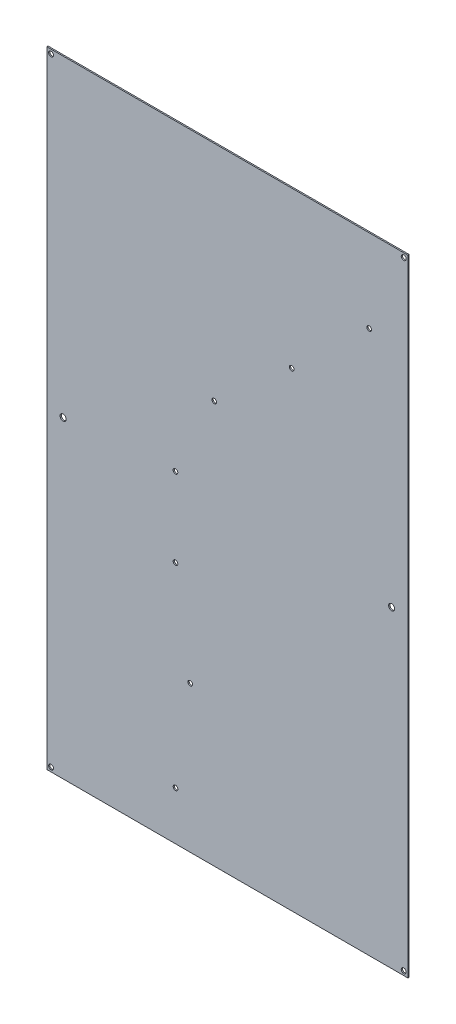
ISO-10303-21;
HEADER;
FILE_DESCRIPTION(('STEP AP214'),'2;1');
FILE_NAME('part.step','',(''),(''),'','','');
FILE_SCHEMA(('AUTOMOTIVE_DESIGN { 1 0 10303 214 1 1 1 1 }'));
ENDSEC;
DATA;
#1=APPLICATION_CONTEXT('core data for automotive mechanical design processes');
#2=APPLICATION_PROTOCOL_DEFINITION('international standard','automotive_design',2000,#1);
#3=PRODUCT_CONTEXT('',#1,'mechanical');
#4=PRODUCT('Part','Part','',(#3));
#5=PRODUCT_RELATED_PRODUCT_CATEGORY('part','',(#4));
#6=PRODUCT_DEFINITION_FORMATION('','',#4);
#7=PRODUCT_DEFINITION_CONTEXT('part definition',#1,'design');
#8=PRODUCT_DEFINITION('design','',#6,#7);
#9=PRODUCT_DEFINITION_SHAPE('','',#8);
#10=(LENGTH_UNIT() NAMED_UNIT(*) SI_UNIT(.MILLI.,.METRE.));
#11=(NAMED_UNIT(*) PLANE_ANGLE_UNIT() SI_UNIT($,.RADIAN.));
#12=(NAMED_UNIT(*) SI_UNIT($,.STERADIAN.) SOLID_ANGLE_UNIT());
#13=UNCERTAINTY_MEASURE_WITH_UNIT(LENGTH_MEASURE(1.E-05),#10,'distance_accuracy_value','');
#14=(GEOMETRIC_REPRESENTATION_CONTEXT(3) GLOBAL_UNCERTAINTY_ASSIGNED_CONTEXT((#13)) GLOBAL_UNIT_ASSIGNED_CONTEXT((#10,
#11,#12)) REPRESENTATION_CONTEXT('',''));
#15=CARTESIAN_POINT('',(0.,0.,0.));
#16=DIRECTION('',(0.,0.,1.));
#17=DIRECTION('',(1.,0.,0.));
#18=AXIS2_PLACEMENT_3D('',#15,#16,#17);
#19=CARTESIAN_POINT('',(-107.847593141209,110.081394098945,1.6002));
#20=DIRECTION('',(0.,0.,1.));
#21=DIRECTION('',(1.,0.,0.));
#22=AXIS2_PLACEMENT_3D('',#19,#20,#21);
#23=PLANE('',#22);
#24=CARTESIAN_POINT('',(58.1864068587912,172.670495629927,1.6002));
#25=DIRECTION('',(0.,0.,1.));
#26=DIRECTION('',(1.,0.,0.));
#27=AXIS2_PLACEMENT_3D('',#24,#25,#26);
#28=CIRCLE('',#27,2.99999999999999);
#29=CARTESIAN_POINT('',(61.1864068587911,172.670495629927,1.6002));
#30=VERTEX_POINT('',#29);
#31=EDGE_CURVE('E175',#30,#30,#28,.T.);
#32=ORIENTED_EDGE('',*,*,#31,.F.);
#33=EDGE_LOOP('',(#32));
#34=FACE_BOUND('',#33,.T.);
#35=CARTESIAN_POINT('',(58.1524068587911,526.393495629927,1.6002));
#36=DIRECTION('',(0.,0.,1.));
#37=DIRECTION('',(1.,0.,0.));
#38=AXIS2_PLACEMENT_3D('',#35,#36,#37);
#39=CIRCLE('',#38,2.99999999999999);
#40=CARTESIAN_POINT('',(61.1524068587911,526.393495629927,1.6002));
#41=VERTEX_POINT('',#40);
#42=EDGE_CURVE('E163',#41,#41,#39,.T.);
#43=ORIENTED_EDGE('',*,*,#42,.F.);
#44=EDGE_LOOP('',(#43));
#45=FACE_BOUND('',#44,.T.);
#46=CARTESIAN_POINT('',(208.152406858791,716.583495629927,1.6002));
#47=DIRECTION('',(0.,0.,1.));
#48=DIRECTION('',(1.,0.,0.));
#49=AXIS2_PLACEMENT_3D('',#46,#47,#48);
#50=CIRCLE('',#49,2.99999999999999);
#51=CARTESIAN_POINT('',(211.152406858791,716.583495629927,1.6002));
#52=VERTEX_POINT('',#51);
#53=EDGE_CURVE('E151',#52,#52,#50,.T.);
#54=ORIENTED_EDGE('',*,*,#53,.F.);
#55=EDGE_LOOP('',(#54));
#56=FACE_BOUND('',#55,.T.);
#57=CARTESIAN_POINT('',(337.198426858791,514.031444864436,1.6002));
#58=DIRECTION('',(0.,0.,1.));
#59=DIRECTION('',(1.,0.,0.));
#60=AXIS2_PLACEMENT_3D('',#57,#58,#59);
#61=CIRCLE('',#60,3.96875000000003);
#62=CARTESIAN_POINT('',(341.167176858791,514.031444864436,1.6002));
#63=VERTEX_POINT('',#62);
#64=EDGE_CURVE('E139',#63,#63,#61,.T.);
#65=ORIENTED_EDGE('',*,*,#64,.F.);
#66=EDGE_LOOP('',(#65));
#67=FACE_BOUND('',#66,.T.);
#68=CARTESIAN_POINT('',(352.710206858791,912.540362180448,1.6002));
#69=DIRECTION('',(0.,0.,1.));
#70=DIRECTION('',(1.,0.,0.));
#71=AXIS2_PLACEMENT_3D('',#68,#69,#70);
#72=CIRCLE('',#71,3.17500000000002);
#73=CARTESIAN_POINT('',(355.885206858791,912.540362180448,1.6002));
#74=VERTEX_POINT('',#73);
#75=EDGE_CURVE('E127',#74,#74,#72,.T.);
#76=ORIENTED_EDGE('',*,*,#75,.F.);
#77=EDGE_LOOP('',(#76));
#78=FACE_BOUND('',#77,.T.);
#79=CARTESIAN_POINT('',(352.710206858791,115.522426028622,1.6002));
#80=DIRECTION('',(0.,0.,1.));
#81=DIRECTION('',(1.,0.,0.));
#82=AXIS2_PLACEMENT_3D('',#79,#80,#81);
#83=CIRCLE('',#82,3.17499999999997);
#84=CARTESIAN_POINT('',(355.885206858791,115.522426028622,1.6002));
#85=VERTEX_POINT('',#84);
#86=EDGE_CURVE('E115',#85,#85,#83,.T.);
#87=ORIENTED_EDGE('',*,*,#86,.F.);
#88=EDGE_LOOP('',(#87));
#89=FACE_BOUND('',#88,.T.);
#90=DIRECTION('',(0.,-1.,0.));
#91=VECTOR('',#90,1.);
#92=CARTESIAN_POINT('',(-107.847593141209,917.981495629927,1.6002));
#93=LINE('',#92,#91);
#94=CARTESIAN_POINT('',(-107.847593141209,917.981495629927,1.6002));
#95=VERTEX_POINT('',#94);
#96=CARTESIAN_POINT('',(-107.847593141209,110.081394098945,1.6002));
#97=VERTEX_POINT('',#96);
#98=EDGE_CURVE('E85',#95,#97,#93,.T.);
#99=ORIENTED_EDGE('',*,*,#98,.T.);
#100=DIRECTION('',(1.,0.,0.));
#101=VECTOR('',#100,1.);
#102=CARTESIAN_POINT('',(-107.847593141209,110.081394098945,1.6002));
#103=LINE('',#102,#101);
#104=CARTESIAN_POINT('',(358.152406858791,110.081394098945,1.6002));
#105=VERTEX_POINT('',#104);
#106=EDGE_CURVE('E80',#97,#105,#103,.T.);
#107=ORIENTED_EDGE('',*,*,#106,.T.);
#108=DIRECTION('',(0.,1.,0.));
#109=VECTOR('',#108,1.);
#110=CARTESIAN_POINT('',(358.152406858791,917.981495629927,1.6002));
#111=LINE('',#110,#109);
#112=CARTESIAN_POINT('',(358.152406858791,917.981495629927,1.6002));
#113=VERTEX_POINT('',#112);
#114=EDGE_CURVE('E83',#105,#113,#111,.T.);
#115=ORIENTED_EDGE('',*,*,#114,.T.);
#116=DIRECTION('',(-1.,0.,0.));
#117=VECTOR('',#116,1.);
#118=CARTESIAN_POINT('',(358.152406858791,917.981495629927,1.6002));
#119=LINE('',#118,#117);
#120=EDGE_CURVE('E50',#113,#95,#119,.T.);
#121=ORIENTED_EDGE('',*,*,#120,.T.);
#122=EDGE_LOOP('',(#99,#107,#115,#121));
#123=FACE_BOUND('',#122,.T.);
#124=CARTESIAN_POINT('',(-102.405393141209,115.522426028622,1.6002));
#125=DIRECTION('',(0.,0.,1.));
#126=DIRECTION('',(1.,0.,0.));
#127=AXIS2_PLACEMENT_3D('',#124,#125,#126);
#128=CIRCLE('',#127,3.175);
#129=CARTESIAN_POINT('',(-99.2303931412092,115.522426028622,1.6002));
#130=VERTEX_POINT('',#129);
#131=EDGE_CURVE('E100',#130,#130,#128,.T.);
#132=ORIENTED_EDGE('',*,*,#131,.F.);
#133=EDGE_LOOP('',(#132));
#134=FACE_BOUND('',#133,.T.);
#135=CARTESIAN_POINT('',(-102.405393141209,912.540362180448,1.6002));
#136=DIRECTION('',(0.,0.,1.));
#137=DIRECTION('',(1.,0.,0.));
#138=AXIS2_PLACEMENT_3D('',#135,#136,#137);
#139=CIRCLE('',#138,3.17499999999996);
#140=CARTESIAN_POINT('',(-99.230393141209,912.540362180448,1.6002));
#141=VERTEX_POINT('',#140);
#142=EDGE_CURVE('E121',#141,#141,#139,.T.);
#143=ORIENTED_EDGE('',*,*,#142,.F.);
#144=EDGE_LOOP('',(#143));
#145=FACE_BOUND('',#144,.T.);
#146=CARTESIAN_POINT('',(-86.8936131412092,514.031444864436,1.6002));
#147=DIRECTION('',(0.,0.,1.));
#148=DIRECTION('',(1.,0.,0.));
#149=AXIS2_PLACEMENT_3D('',#146,#147,#148);
#150=CIRCLE('',#149,3.96874999999998);
#151=CARTESIAN_POINT('',(-82.9248631412092,514.031444864436,1.6002));
#152=VERTEX_POINT('',#151);
#153=EDGE_CURVE('E133',#152,#152,#150,.T.);
#154=ORIENTED_EDGE('',*,*,#153,.F.);
#155=EDGE_LOOP('',(#154));
#156=FACE_BOUND('',#155,.T.);
#157=CARTESIAN_POINT('',(308.152406858791,811.155495629927,1.6002));
#158=DIRECTION('',(0.,0.,1.));
#159=DIRECTION('',(1.,0.,0.));
#160=AXIS2_PLACEMENT_3D('',#157,#158,#159);
#161=CIRCLE('',#160,2.99999999999999);
#162=CARTESIAN_POINT('',(311.152406858791,811.155495629927,1.6002));
#163=VERTEX_POINT('',#162);
#164=EDGE_CURVE('E145',#163,#163,#161,.T.);
#165=ORIENTED_EDGE('',*,*,#164,.F.);
#166=EDGE_LOOP('',(#165));
#167=FACE_BOUND('',#166,.T.);
#168=CARTESIAN_POINT('',(108.152406858791,630.078495629927,1.6002));
#169=DIRECTION('',(0.,0.,1.));
#170=DIRECTION('',(1.,0.,0.));
#171=AXIS2_PLACEMENT_3D('',#168,#169,#170);
#172=CIRCLE('',#171,3.00000000000001);
#173=CARTESIAN_POINT('',(111.152406858791,630.078495629927,1.6002));
#174=VERTEX_POINT('',#173);
#175=EDGE_CURVE('E157',#174,#174,#172,.T.);
#176=ORIENTED_EDGE('',*,*,#175,.F.);
#177=EDGE_LOOP('',(#176));
#178=FACE_BOUND('',#177,.T.);
#179=CARTESIAN_POINT('',(77.1524068587911,298.981495629927,1.6002));
#180=DIRECTION('',(0.,0.,1.));
#181=DIRECTION('',(1.,0.,0.));
#182=AXIS2_PLACEMENT_3D('',#179,#180,#181);
#183=CIRCLE('',#182,3.00000000000001);
#184=CARTESIAN_POINT('',(80.1524068587911,298.981495629927,1.6002));
#185=VERTEX_POINT('',#184);
#186=EDGE_CURVE('E169',#185,#185,#183,.T.);
#187=ORIENTED_EDGE('',*,*,#186,.F.);
#188=EDGE_LOOP('',(#187));
#189=FACE_BOUND('',#188,.T.);
#190=CARTESIAN_POINT('',(58.1864068587911,424.374495629927,1.6002));
#191=DIRECTION('',(0.,0.,1.));
#192=DIRECTION('',(1.,0.,0.));
#193=AXIS2_PLACEMENT_3D('',#190,#191,#192);
#194=CIRCLE('',#193,3.);
#195=CARTESIAN_POINT('',(61.1864068587911,424.374495629927,1.6002));
#196=VERTEX_POINT('',#195);
#197=EDGE_CURVE('E181',#196,#196,#194,.T.);
#198=ORIENTED_EDGE('',*,*,#197,.F.);
#199=EDGE_LOOP('',(#198));
#200=FACE_BOUND('',#199,.T.);
#201=ADVANCED_FACE('F33',(#34,#45,#56,#67,#78,#89,#123,#134,#145,#156,#167,#178,#189,#200),#23,.T.);
#202=CARTESIAN_POINT('',(-107.847593141209,110.081394098945,0.));
#203=DIRECTION('',(0.,0.,1.));
#204=DIRECTION('',(1.,0.,0.));
#205=AXIS2_PLACEMENT_3D('',#202,#203,#204);
#206=PLANE('',#205);
#207=CARTESIAN_POINT('',(58.1864068587912,172.670495629927,0.));
#208=DIRECTION('',(0.,0.,1.));
#209=DIRECTION('',(1.,0.,0.));
#210=AXIS2_PLACEMENT_3D('',#207,#208,#209);
#211=CIRCLE('',#210,2.99999999999999);
#212=CARTESIAN_POINT('',(61.1864068587911,172.670495629927,0.));
#213=VERTEX_POINT('',#212);
#214=EDGE_CURVE('E178',#213,#213,#211,.T.);
#215=ORIENTED_EDGE('',*,*,#214,.T.);
#216=EDGE_LOOP('',(#215));
#217=FACE_BOUND('',#216,.T.);
#218=CARTESIAN_POINT('',(58.1524068587911,526.393495629927,0.));
#219=DIRECTION('',(0.,0.,1.));
#220=DIRECTION('',(1.,0.,0.));
#221=AXIS2_PLACEMENT_3D('',#218,#219,#220);
#222=CIRCLE('',#221,2.99999999999999);
#223=CARTESIAN_POINT('',(61.1524068587911,526.393495629927,0.));
#224=VERTEX_POINT('',#223);
#225=EDGE_CURVE('E166',#224,#224,#222,.T.);
#226=ORIENTED_EDGE('',*,*,#225,.T.);
#227=EDGE_LOOP('',(#226));
#228=FACE_BOUND('',#227,.T.);
#229=CARTESIAN_POINT('',(208.152406858791,716.583495629927,0.));
#230=DIRECTION('',(0.,0.,1.));
#231=DIRECTION('',(1.,0.,0.));
#232=AXIS2_PLACEMENT_3D('',#229,#230,#231);
#233=CIRCLE('',#232,2.99999999999999);
#234=CARTESIAN_POINT('',(211.152406858791,716.583495629927,0.));
#235=VERTEX_POINT('',#234);
#236=EDGE_CURVE('E154',#235,#235,#233,.T.);
#237=ORIENTED_EDGE('',*,*,#236,.T.);
#238=EDGE_LOOP('',(#237));
#239=FACE_BOUND('',#238,.T.);
#240=CARTESIAN_POINT('',(337.198426858791,514.031444864436,0.));
#241=DIRECTION('',(0.,0.,1.));
#242=DIRECTION('',(1.,0.,0.));
#243=AXIS2_PLACEMENT_3D('',#240,#241,#242);
#244=CIRCLE('',#243,3.96875000000003);
#245=CARTESIAN_POINT('',(341.167176858791,514.031444864436,0.));
#246=VERTEX_POINT('',#245);
#247=EDGE_CURVE('E142',#246,#246,#244,.T.);
#248=ORIENTED_EDGE('',*,*,#247,.T.);
#249=EDGE_LOOP('',(#248));
#250=FACE_BOUND('',#249,.T.);
#251=CARTESIAN_POINT('',(352.710206858791,912.540362180448,0.));
#252=DIRECTION('',(0.,0.,1.));
#253=DIRECTION('',(1.,0.,0.));
#254=AXIS2_PLACEMENT_3D('',#251,#252,#253);
#255=CIRCLE('',#254,3.17500000000002);
#256=CARTESIAN_POINT('',(355.885206858791,912.540362180448,0.));
#257=VERTEX_POINT('',#256);
#258=EDGE_CURVE('E130',#257,#257,#255,.T.);
#259=ORIENTED_EDGE('',*,*,#258,.T.);
#260=EDGE_LOOP('',(#259));
#261=FACE_BOUND('',#260,.T.);
#262=CARTESIAN_POINT('',(352.710206858791,115.522426028622,0.));
#263=DIRECTION('',(0.,0.,1.));
#264=DIRECTION('',(1.,0.,0.));
#265=AXIS2_PLACEMENT_3D('',#262,#263,#264);
#266=CIRCLE('',#265,3.17499999999997);
#267=CARTESIAN_POINT('',(355.885206858791,115.522426028622,0.));
#268=VERTEX_POINT('',#267);
#269=EDGE_CURVE('E118',#268,#268,#266,.T.);
#270=ORIENTED_EDGE('',*,*,#269,.T.);
#271=EDGE_LOOP('',(#270));
#272=FACE_BOUND('',#271,.T.);
#273=DIRECTION('',(0.,-1.,0.));
#274=VECTOR('',#273,1.);
#275=CARTESIAN_POINT('',(-107.847593141209,917.981495629927,0.));
#276=LINE('',#275,#274);
#277=CARTESIAN_POINT('',(-107.847593141209,917.981495629927,0.));
#278=VERTEX_POINT('',#277);
#279=CARTESIAN_POINT('',(-107.847593141209,110.081394098945,0.));
#280=VERTEX_POINT('',#279);
#281=EDGE_CURVE('E97',#278,#280,#276,.T.);
#282=ORIENTED_EDGE('',*,*,#281,.F.);
#283=DIRECTION('',(-1.,0.,0.));
#284=VECTOR('',#283,1.);
#285=CARTESIAN_POINT('',(358.152406858791,917.981495629927,0.));
#286=LINE('',#285,#284);
#287=CARTESIAN_POINT('',(358.152406858791,917.981495629927,0.));
#288=VERTEX_POINT('',#287);
#289=EDGE_CURVE('E73',#288,#278,#286,.T.);
#290=ORIENTED_EDGE('',*,*,#289,.F.);
#291=DIRECTION('',(0.,1.,0.));
#292=VECTOR('',#291,1.);
#293=CARTESIAN_POINT('',(358.152406858791,917.981495629927,0.));
#294=LINE('',#293,#292);
#295=CARTESIAN_POINT('',(358.152406858791,110.081394098945,0.));
#296=VERTEX_POINT('',#295);
#297=EDGE_CURVE('E67',#296,#288,#294,.T.);
#298=ORIENTED_EDGE('',*,*,#297,.F.);
#299=DIRECTION('',(1.,0.,0.));
#300=VECTOR('',#299,1.);
#301=CARTESIAN_POINT('',(-107.847593141209,110.081394098945,0.));
#302=LINE('',#301,#300);
#303=EDGE_CURVE('E89',#280,#296,#302,.T.);
#304=ORIENTED_EDGE('',*,*,#303,.F.);
#305=EDGE_LOOP('',(#282,#290,#298,#304));
#306=FACE_BOUND('',#305,.T.);
#307=CARTESIAN_POINT('',(-102.405393141209,115.522426028622,0.));
#308=DIRECTION('',(0.,0.,1.));
#309=DIRECTION('',(1.,0.,0.));
#310=AXIS2_PLACEMENT_3D('',#307,#308,#309);
#311=CIRCLE('',#310,3.175);
#312=CARTESIAN_POINT('',(-99.2303931412092,115.522426028622,0.));
#313=VERTEX_POINT('',#312);
#314=EDGE_CURVE('E112',#313,#313,#311,.T.);
#315=ORIENTED_EDGE('',*,*,#314,.T.);
#316=EDGE_LOOP('',(#315));
#317=FACE_BOUND('',#316,.T.);
#318=CARTESIAN_POINT('',(-102.405393141209,912.540362180448,0.));
#319=DIRECTION('',(0.,0.,1.));
#320=DIRECTION('',(1.,0.,0.));
#321=AXIS2_PLACEMENT_3D('',#318,#319,#320);
#322=CIRCLE('',#321,3.17499999999996);
#323=CARTESIAN_POINT('',(-99.230393141209,912.540362180448,0.));
#324=VERTEX_POINT('',#323);
#325=EDGE_CURVE('E124',#324,#324,#322,.T.);
#326=ORIENTED_EDGE('',*,*,#325,.T.);
#327=EDGE_LOOP('',(#326));
#328=FACE_BOUND('',#327,.T.);
#329=CARTESIAN_POINT('',(-86.8936131412092,514.031444864436,0.));
#330=DIRECTION('',(0.,0.,1.));
#331=DIRECTION('',(1.,0.,0.));
#332=AXIS2_PLACEMENT_3D('',#329,#330,#331);
#333=CIRCLE('',#332,3.96874999999998);
#334=CARTESIAN_POINT('',(-82.9248631412092,514.031444864436,0.));
#335=VERTEX_POINT('',#334);
#336=EDGE_CURVE('E136',#335,#335,#333,.T.);
#337=ORIENTED_EDGE('',*,*,#336,.T.);
#338=EDGE_LOOP('',(#337));
#339=FACE_BOUND('',#338,.T.);
#340=CARTESIAN_POINT('',(308.152406858791,811.155495629927,0.));
#341=DIRECTION('',(0.,0.,1.));
#342=DIRECTION('',(1.,0.,0.));
#343=AXIS2_PLACEMENT_3D('',#340,#341,#342);
#344=CIRCLE('',#343,2.99999999999999);
#345=CARTESIAN_POINT('',(311.152406858791,811.155495629927,0.));
#346=VERTEX_POINT('',#345);
#347=EDGE_CURVE('E148',#346,#346,#344,.T.);
#348=ORIENTED_EDGE('',*,*,#347,.T.);
#349=EDGE_LOOP('',(#348));
#350=FACE_BOUND('',#349,.T.);
#351=CARTESIAN_POINT('',(108.152406858791,630.078495629927,0.));
#352=DIRECTION('',(0.,0.,1.));
#353=DIRECTION('',(1.,0.,0.));
#354=AXIS2_PLACEMENT_3D('',#351,#352,#353);
#355=CIRCLE('',#354,3.00000000000001);
#356=CARTESIAN_POINT('',(111.152406858791,630.078495629927,0.));
#357=VERTEX_POINT('',#356);
#358=EDGE_CURVE('E160',#357,#357,#355,.T.);
#359=ORIENTED_EDGE('',*,*,#358,.T.);
#360=EDGE_LOOP('',(#359));
#361=FACE_BOUND('',#360,.T.);
#362=CARTESIAN_POINT('',(77.1524068587911,298.981495629927,0.));
#363=DIRECTION('',(0.,0.,1.));
#364=DIRECTION('',(1.,0.,0.));
#365=AXIS2_PLACEMENT_3D('',#362,#363,#364);
#366=CIRCLE('',#365,3.00000000000001);
#367=CARTESIAN_POINT('',(80.1524068587911,298.981495629927,0.));
#368=VERTEX_POINT('',#367);
#369=EDGE_CURVE('E172',#368,#368,#366,.T.);
#370=ORIENTED_EDGE('',*,*,#369,.T.);
#371=EDGE_LOOP('',(#370));
#372=FACE_BOUND('',#371,.T.);
#373=CARTESIAN_POINT('',(58.1864068587911,424.374495629927,0.));
#374=DIRECTION('',(0.,0.,1.));
#375=DIRECTION('',(1.,0.,0.));
#376=AXIS2_PLACEMENT_3D('',#373,#374,#375);
#377=CIRCLE('',#376,3.);
#378=CARTESIAN_POINT('',(61.1864068587911,424.374495629927,0.));
#379=VERTEX_POINT('',#378);
#380=EDGE_CURVE('E184',#379,#379,#377,.T.);
#381=ORIENTED_EDGE('',*,*,#380,.T.);
#382=EDGE_LOOP('',(#381));
#383=FACE_BOUND('',#382,.T.);
#384=ADVANCED_FACE('F108',(#217,#228,#239,#250,#261,#272,#306,#317,#328,#339,#350,#361,#372,
#383),#206,.F.);
#385=CARTESIAN_POINT('',(-107.847593141209,917.981495629927,1.6002));
#386=DIRECTION('',(1.,0.,0.));
#387=DIRECTION('',(0.,0.,-1.));
#388=AXIS2_PLACEMENT_3D('',#385,#386,#387);
#389=PLANE('',#388);
#390=ORIENTED_EDGE('',*,*,#281,.T.);
#391=DIRECTION('',(0.,0.,-1.));
#392=VECTOR('',#391,1.);
#393=CARTESIAN_POINT('',(-107.847593141209,110.081394098945,1.6002));
#394=LINE('',#393,#392);
#395=EDGE_CURVE('E11',#97,#280,#394,.T.);
#396=ORIENTED_EDGE('',*,*,#395,.F.);
#397=ORIENTED_EDGE('',*,*,#98,.F.);
#398=DIRECTION('',(0.,0.,-1.));
#399=VECTOR('',#398,1.);
#400=CARTESIAN_POINT('',(-107.847593141209,917.981495629927,1.6002));
#401=LINE('',#400,#399);
#402=EDGE_CURVE('E93',#95,#278,#401,.T.);
#403=ORIENTED_EDGE('',*,*,#402,.T.);
#404=EDGE_LOOP('',(#390,#396,#397,#403));
#405=FACE_BOUND('',#404,.T.);
#406=ADVANCED_FACE('F35',(#405),#389,.F.);
#407=CARTESIAN_POINT('',(-107.847593141209,110.081394098945,1.6002));
#408=DIRECTION('',(0.,1.,0.));
#409=DIRECTION('',(-1.,0.,0.));
#410=AXIS2_PLACEMENT_3D('',#407,#408,#409);
#411=PLANE('',#410);
#412=ORIENTED_EDGE('',*,*,#303,.T.);
#413=DIRECTION('',(0.,0.,-1.));
#414=VECTOR('',#413,1.);
#415=CARTESIAN_POINT('',(358.152406858791,110.081394098945,1.6002));
#416=LINE('',#415,#414);
#417=EDGE_CURVE('E42',#105,#296,#416,.T.);
#418=ORIENTED_EDGE('',*,*,#417,.F.);
#419=ORIENTED_EDGE('',*,*,#106,.F.);
#420=ORIENTED_EDGE('',*,*,#395,.T.);
#421=EDGE_LOOP('',(#412,#418,#419,#420));
#422=FACE_BOUND('',#421,.T.);
#423=ADVANCED_FACE('F88',(#422),#411,.F.);
#424=CARTESIAN_POINT('',(358.152406858791,917.981495629927,1.6002));
#425=DIRECTION('',(-1.,0.,0.));
#426=DIRECTION('',(0.,0.,1.));
#427=AXIS2_PLACEMENT_3D('',#424,#425,#426);
#428=PLANE('',#427);
#429=ORIENTED_EDGE('',*,*,#297,.T.);
#430=DIRECTION('',(0.,0.,-1.));
#431=VECTOR('',#430,1.);
#432=CARTESIAN_POINT('',(358.152406858791,917.981495629927,1.6002));
#433=LINE('',#432,#431);
#434=EDGE_CURVE('E90',#113,#288,#433,.T.);
#435=ORIENTED_EDGE('',*,*,#434,.F.);
#436=ORIENTED_EDGE('',*,*,#114,.F.);
#437=ORIENTED_EDGE('',*,*,#417,.T.);
#438=EDGE_LOOP('',(#429,#435,#436,#437));
#439=FACE_BOUND('',#438,.T.);
#440=ADVANCED_FACE('F91',(#439),#428,.F.);
#441=CARTESIAN_POINT('',(358.152406858791,917.981495629927,1.6002));
#442=DIRECTION('',(0.,-1.,0.));
#443=DIRECTION('',(0.,0.,-1.));
#444=AXIS2_PLACEMENT_3D('',#441,#442,#443);
#445=PLANE('',#444);
#446=ORIENTED_EDGE('',*,*,#289,.T.);
#447=ORIENTED_EDGE('',*,*,#402,.F.);
#448=ORIENTED_EDGE('',*,*,#120,.F.);
#449=ORIENTED_EDGE('',*,*,#434,.T.);
#450=EDGE_LOOP('',(#446,#447,#448,#449));
#451=FACE_BOUND('',#450,.T.);
#452=ADVANCED_FACE('F105',(#451),#445,.F.);
#453=CARTESIAN_POINT('',(-102.405393141209,115.522426028622,1.6002));
#454=DIRECTION('',(0.,0.,-1.));
#455=DIRECTION('',(-1.,0.,0.));
#456=AXIS2_PLACEMENT_3D('',#453,#454,#455);
#457=CYLINDRICAL_SURFACE('',#456,3.175);
#458=ORIENTED_EDGE('',*,*,#131,.T.);
#459=EDGE_LOOP('',(#458));
#460=FACE_BOUND('',#459,.T.);
#461=ORIENTED_EDGE('',*,*,#314,.F.);
#462=EDGE_LOOP('',(#461));
#463=FACE_BOUND('',#462,.T.);
#464=ADVANCED_FACE('F204',(#460,#463),#457,.F.);
#465=CARTESIAN_POINT('',(352.710206858791,115.522426028622,1.6002));
#466=DIRECTION('',(0.,0.,-1.));
#467=DIRECTION('',(-1.,0.,0.));
#468=AXIS2_PLACEMENT_3D('',#465,#466,#467);
#469=CYLINDRICAL_SURFACE('',#468,3.17499999999997);
#470=ORIENTED_EDGE('',*,*,#86,.T.);
#471=EDGE_LOOP('',(#470));
#472=FACE_BOUND('',#471,.T.);
#473=ORIENTED_EDGE('',*,*,#269,.F.);
#474=EDGE_LOOP('',(#473));
#475=FACE_BOUND('',#474,.T.);
#476=ADVANCED_FACE('F250',(#472,#475),#469,.F.);
#477=CARTESIAN_POINT('',(-102.405393141209,912.540362180448,1.6002));
#478=DIRECTION('',(0.,0.,-1.));
#479=DIRECTION('',(-1.,0.,0.));
#480=AXIS2_PLACEMENT_3D('',#477,#478,#479);
#481=CYLINDRICAL_SURFACE('',#480,3.17499999999996);
#482=ORIENTED_EDGE('',*,*,#142,.T.);
#483=EDGE_LOOP('',(#482));
#484=FACE_BOUND('',#483,.T.);
#485=ORIENTED_EDGE('',*,*,#325,.F.);
#486=EDGE_LOOP('',(#485));
#487=FACE_BOUND('',#486,.T.);
#488=ADVANCED_FACE('F258',(#484,#487),#481,.F.);
#489=CARTESIAN_POINT('',(352.710206858791,912.540362180448,1.6002));
#490=DIRECTION('',(0.,0.,-1.));
#491=DIRECTION('',(-1.,0.,0.));
#492=AXIS2_PLACEMENT_3D('',#489,#490,#491);
#493=CYLINDRICAL_SURFACE('',#492,3.17500000000002);
#494=ORIENTED_EDGE('',*,*,#75,.T.);
#495=EDGE_LOOP('',(#494));
#496=FACE_BOUND('',#495,.T.);
#497=ORIENTED_EDGE('',*,*,#258,.F.);
#498=EDGE_LOOP('',(#497));
#499=FACE_BOUND('',#498,.T.);
#500=ADVANCED_FACE('F266',(#496,#499),#493,.F.);
#501=CARTESIAN_POINT('',(-86.8936131412092,514.031444864436,1.6002));
#502=DIRECTION('',(0.,0.,-1.));
#503=DIRECTION('',(-1.,0.,0.));
#504=AXIS2_PLACEMENT_3D('',#501,#502,#503);
#505=CYLINDRICAL_SURFACE('',#504,3.96874999999998);
#506=ORIENTED_EDGE('',*,*,#153,.T.);
#507=EDGE_LOOP('',(#506));
#508=FACE_BOUND('',#507,.T.);
#509=ORIENTED_EDGE('',*,*,#336,.F.);
#510=EDGE_LOOP('',(#509));
#511=FACE_BOUND('',#510,.T.);
#512=ADVANCED_FACE('F275',(#508,#511),#505,.F.);
#513=CARTESIAN_POINT('',(337.198426858791,514.031444864436,1.6002));
#514=DIRECTION('',(0.,0.,-1.));
#515=DIRECTION('',(-1.,0.,0.));
#516=AXIS2_PLACEMENT_3D('',#513,#514,#515);
#517=CYLINDRICAL_SURFACE('',#516,3.96875000000003);
#518=ORIENTED_EDGE('',*,*,#64,.T.);
#519=EDGE_LOOP('',(#518));
#520=FACE_BOUND('',#519,.T.);
#521=ORIENTED_EDGE('',*,*,#247,.F.);
#522=EDGE_LOOP('',(#521));
#523=FACE_BOUND('',#522,.T.);
#524=ADVANCED_FACE('F284',(#520,#523),#517,.F.);
#525=CARTESIAN_POINT('',(308.152406858791,811.155495629927,1.6002));
#526=DIRECTION('',(0.,0.,-1.));
#527=DIRECTION('',(-1.,0.,0.));
#528=AXIS2_PLACEMENT_3D('',#525,#526,#527);
#529=CYLINDRICAL_SURFACE('',#528,2.99999999999999);
#530=ORIENTED_EDGE('',*,*,#164,.T.);
#531=EDGE_LOOP('',(#530));
#532=FACE_BOUND('',#531,.T.);
#533=ORIENTED_EDGE('',*,*,#347,.F.);
#534=EDGE_LOOP('',(#533));
#535=FACE_BOUND('',#534,.T.);
#536=ADVANCED_FACE('F293',(#532,#535),#529,.F.);
#537=CARTESIAN_POINT('',(208.152406858791,716.583495629927,1.6002));
#538=DIRECTION('',(0.,0.,-1.));
#539=DIRECTION('',(-1.,0.,0.));
#540=AXIS2_PLACEMENT_3D('',#537,#538,#539);
#541=CYLINDRICAL_SURFACE('',#540,2.99999999999999);
#542=ORIENTED_EDGE('',*,*,#53,.T.);
#543=EDGE_LOOP('',(#542));
#544=FACE_BOUND('',#543,.T.);
#545=ORIENTED_EDGE('',*,*,#236,.F.);
#546=EDGE_LOOP('',(#545));
#547=FACE_BOUND('',#546,.T.);
#548=ADVANCED_FACE('F302',(#544,#547),#541,.F.);
#549=CARTESIAN_POINT('',(108.152406858791,630.078495629927,1.6002));
#550=DIRECTION('',(0.,0.,-1.));
#551=DIRECTION('',(-1.,0.,0.));
#552=AXIS2_PLACEMENT_3D('',#549,#550,#551);
#553=CYLINDRICAL_SURFACE('',#552,3.00000000000001);
#554=ORIENTED_EDGE('',*,*,#175,.T.);
#555=EDGE_LOOP('',(#554));
#556=FACE_BOUND('',#555,.T.);
#557=ORIENTED_EDGE('',*,*,#358,.F.);
#558=EDGE_LOOP('',(#557));
#559=FACE_BOUND('',#558,.T.);
#560=ADVANCED_FACE('F311',(#556,#559),#553,.F.);
#561=CARTESIAN_POINT('',(58.1524068587911,526.393495629927,1.6002));
#562=DIRECTION('',(0.,0.,-1.));
#563=DIRECTION('',(-1.,0.,0.));
#564=AXIS2_PLACEMENT_3D('',#561,#562,#563);
#565=CYLINDRICAL_SURFACE('',#564,2.99999999999999);
#566=ORIENTED_EDGE('',*,*,#42,.T.);
#567=EDGE_LOOP('',(#566));
#568=FACE_BOUND('',#567,.T.);
#569=ORIENTED_EDGE('',*,*,#225,.F.);
#570=EDGE_LOOP('',(#569));
#571=FACE_BOUND('',#570,.T.);
#572=ADVANCED_FACE('F320',(#568,#571),#565,.F.);
#573=CARTESIAN_POINT('',(77.1524068587911,298.981495629927,1.6002));
#574=DIRECTION('',(0.,0.,-1.));
#575=DIRECTION('',(-1.,0.,0.));
#576=AXIS2_PLACEMENT_3D('',#573,#574,#575);
#577=CYLINDRICAL_SURFACE('',#576,3.00000000000001);
#578=ORIENTED_EDGE('',*,*,#186,.T.);
#579=EDGE_LOOP('',(#578));
#580=FACE_BOUND('',#579,.T.);
#581=ORIENTED_EDGE('',*,*,#369,.F.);
#582=EDGE_LOOP('',(#581));
#583=FACE_BOUND('',#582,.T.);
#584=ADVANCED_FACE('F329',(#580,#583),#577,.F.);
#585=CARTESIAN_POINT('',(58.1864068587912,172.670495629927,1.6002));
#586=DIRECTION('',(0.,0.,-1.));
#587=DIRECTION('',(-1.,0.,0.));
#588=AXIS2_PLACEMENT_3D('',#585,#586,#587);
#589=CYLINDRICAL_SURFACE('',#588,2.99999999999999);
#590=ORIENTED_EDGE('',*,*,#31,.T.);
#591=EDGE_LOOP('',(#590));
#592=FACE_BOUND('',#591,.T.);
#593=ORIENTED_EDGE('',*,*,#214,.F.);
#594=EDGE_LOOP('',(#593));
#595=FACE_BOUND('',#594,.T.);
#596=ADVANCED_FACE('F338',(#592,#595),#589,.F.);
#597=CARTESIAN_POINT('',(58.1864068587911,424.374495629927,1.6002));
#598=DIRECTION('',(0.,0.,-1.));
#599=DIRECTION('',(-1.,0.,0.));
#600=AXIS2_PLACEMENT_3D('',#597,#598,#599);
#601=CYLINDRICAL_SURFACE('',#600,3.);
#602=ORIENTED_EDGE('',*,*,#197,.T.);
#603=EDGE_LOOP('',(#602));
#604=FACE_BOUND('',#603,.T.);
#605=ORIENTED_EDGE('',*,*,#380,.F.);
#606=EDGE_LOOP('',(#605));
#607=FACE_BOUND('',#606,.T.);
#608=ADVANCED_FACE('F190',(#604,#607),#601,.F.);
#609=CLOSED_SHELL('',(#201,#384,#406,#423,#440,#452,#464,#476,#488,#500,#512,#524,#536,#548,
#560,#572,#584,#596,#608));
#610=MANIFOLD_SOLID_BREP('B2',#609);
#611=ADVANCED_BREP_SHAPE_REPRESENTATION('',(#18,#610),#14);
#612=SHAPE_DEFINITION_REPRESENTATION(#9,#611);
ENDSEC;
END-ISO-10303-21;
